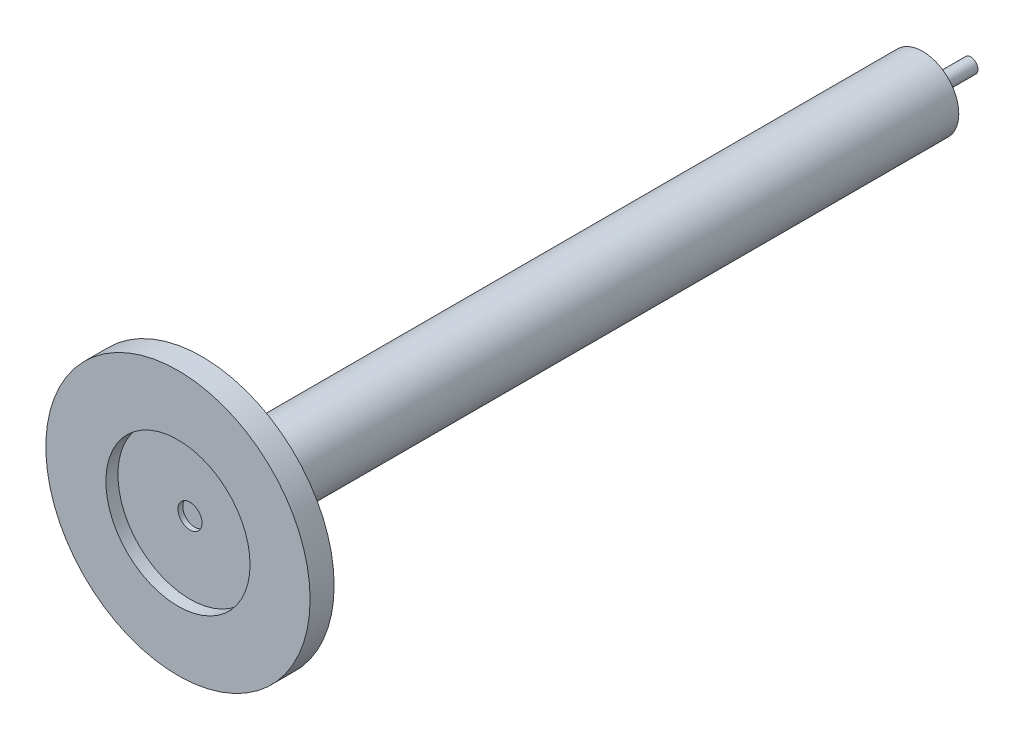
ISO-10303-21;
HEADER;
FILE_DESCRIPTION(('STEP AP214'),'2;1');
FILE_NAME('part.step','',(''),(''),'','','');
FILE_SCHEMA(('AUTOMOTIVE_DESIGN { 1 0 10303 214 1 1 1 1 }'));
ENDSEC;
DATA;
#1=APPLICATION_CONTEXT('core data for automotive mechanical design processes');
#2=APPLICATION_PROTOCOL_DEFINITION('international standard','automotive_design',2000,#1);
#3=PRODUCT_CONTEXT('',#1,'mechanical');
#4=PRODUCT('Part','Part','',(#3));
#5=PRODUCT_RELATED_PRODUCT_CATEGORY('part','',(#4));
#6=PRODUCT_DEFINITION_FORMATION('','',#4);
#7=PRODUCT_DEFINITION_CONTEXT('part definition',#1,'design');
#8=PRODUCT_DEFINITION('design','',#6,#7);
#9=PRODUCT_DEFINITION_SHAPE('','',#8);
#10=(LENGTH_UNIT() NAMED_UNIT(*) SI_UNIT(.MILLI.,.METRE.));
#11=(NAMED_UNIT(*) PLANE_ANGLE_UNIT() SI_UNIT($,.RADIAN.));
#12=(NAMED_UNIT(*) SI_UNIT($,.STERADIAN.) SOLID_ANGLE_UNIT());
#13=UNCERTAINTY_MEASURE_WITH_UNIT(LENGTH_MEASURE(1.E-05),#10,'distance_accuracy_value','');
#14=(GEOMETRIC_REPRESENTATION_CONTEXT(3) GLOBAL_UNCERTAINTY_ASSIGNED_CONTEXT((#13)) GLOBAL_UNIT_ASSIGNED_CONTEXT((#10,
#11,#12)) REPRESENTATION_CONTEXT('',''));
#15=CARTESIAN_POINT('',(0.,0.,0.));
#16=DIRECTION('',(0.,0.,1.));
#17=DIRECTION('',(1.,0.,0.));
#18=AXIS2_PLACEMENT_3D('',#15,#16,#17);
#19=CARTESIAN_POINT('',(0.,0.,-762.));
#20=DIRECTION('',(0.,0.,-1.));
#21=DIRECTION('',(-1.,0.,0.));
#22=AXIS2_PLACEMENT_3D('',#19,#20,#21);
#23=PLANE('',#22);
#24=CARTESIAN_POINT('',(0.,0.,-762.));
#25=DIRECTION('',(0.,0.,-1.));
#26=DIRECTION('',(-1.,0.,0.));
#27=AXIS2_PLACEMENT_3D('',#24,#25,#26);
#28=CIRCLE('',#27,38.1);
#29=CARTESIAN_POINT('',(-38.1,0.,-762.));
#30=VERTEX_POINT('',#29);
#31=EDGE_CURVE('E47',#30,#30,#28,.T.);
#32=ORIENTED_EDGE('',*,*,#31,.T.);
#33=EDGE_LOOP('',(#32));
#34=FACE_BOUND('',#33,.T.);
#35=CARTESIAN_POINT('',(0.,0.,-762.));
#36=DIRECTION('',(0.,0.,-1.));
#37=DIRECTION('',(-1.,0.,0.));
#38=AXIS2_PLACEMENT_3D('',#35,#36,#37);
#39=CIRCLE('',#38,7.62);
#40=CARTESIAN_POINT('',(-7.62,0.,-762.));
#41=VERTEX_POINT('',#40);
#42=EDGE_CURVE('E52',#41,#41,#39,.T.);
#43=ORIENTED_EDGE('',*,*,#42,.F.);
#44=EDGE_LOOP('',(#43));
#45=FACE_BOUND('',#44,.T.);
#46=ADVANCED_FACE('F31',(#34,#45),#23,.T.);
#47=CARTESIAN_POINT('',(0.,0.,0.));
#48=DIRECTION('',(0.,0.,1.));
#49=DIRECTION('',(1.,0.,0.));
#50=AXIS2_PLACEMENT_3D('',#47,#48,#49);
#51=PLANE('',#50);
#52=CARTESIAN_POINT('',(0.,0.,0.));
#53=DIRECTION('',(0.,0.,1.));
#54=DIRECTION('',(1.,0.,0.));
#55=AXIS2_PLACEMENT_3D('',#52,#53,#54);
#56=CIRCLE('',#55,139.7);
#57=CARTESIAN_POINT('',(139.7,0.,0.));
#58=VERTEX_POINT('',#57);
#59=EDGE_CURVE('E42',#58,#58,#56,.T.);
#60=ORIENTED_EDGE('',*,*,#59,.F.);
#61=EDGE_LOOP('',(#60));
#62=FACE_BOUND('',#61,.T.);
#63=CARTESIAN_POINT('',(0.,0.,0.));
#64=DIRECTION('',(0.,0.,1.));
#65=DIRECTION('',(1.,0.,0.));
#66=AXIS2_PLACEMENT_3D('',#63,#64,#65);
#67=CIRCLE('',#66,38.1);
#68=CARTESIAN_POINT('',(38.1,0.,0.));
#69=VERTEX_POINT('',#68);
#70=EDGE_CURVE('E10',#69,#69,#67,.F.);
#71=ORIENTED_EDGE('',*,*,#70,.F.);
#72=EDGE_LOOP('',(#71));
#73=FACE_BOUND('',#72,.T.);
#74=ADVANCED_FACE('F102',(#62,#73),#51,.F.);
#75=CARTESIAN_POINT('',(0.,0.,25.4));
#76=DIRECTION('',(0.,0.,-1.));
#77=DIRECTION('',(-1.,0.,0.));
#78=AXIS2_PLACEMENT_3D('',#75,#76,#77);
#79=CYLINDRICAL_SURFACE('',#78,139.7);
#80=CARTESIAN_POINT('',(0.,0.,25.4));
#81=DIRECTION('',(0.,0.,1.));
#82=DIRECTION('',(1.,0.,0.));
#83=AXIS2_PLACEMENT_3D('',#80,#81,#82);
#84=CIRCLE('',#83,139.7);
#85=CARTESIAN_POINT('',(139.7,0.,25.4));
#86=VERTEX_POINT('',#85);
#87=EDGE_CURVE('E38',#86,#86,#84,.T.);
#88=ORIENTED_EDGE('',*,*,#87,.F.);
#89=EDGE_LOOP('',(#88));
#90=FACE_BOUND('',#89,.T.);
#91=ORIENTED_EDGE('',*,*,#59,.T.);
#92=EDGE_LOOP('',(#91));
#93=FACE_BOUND('',#92,.T.);
#94=ADVANCED_FACE('F33',(#90,#93),#79,.T.);
#95=CARTESIAN_POINT('',(0.,0.,25.4));
#96=DIRECTION('',(0.,0.,1.));
#97=DIRECTION('',(1.,0.,0.));
#98=AXIS2_PLACEMENT_3D('',#95,#96,#97);
#99=PLANE('',#98);
#100=CARTESIAN_POINT('',(0.,0.,25.4));
#101=DIRECTION('',(0.,0.,1.));
#102=DIRECTION('',(1.,0.,0.));
#103=AXIS2_PLACEMENT_3D('',#100,#101,#102);
#104=CIRCLE('',#103,76.2);
#105=CARTESIAN_POINT('',(76.2,0.,25.4));
#106=VERTEX_POINT('',#105);
#107=EDGE_CURVE('E58',#106,#106,#104,.T.);
#108=ORIENTED_EDGE('',*,*,#107,.F.);
#109=EDGE_LOOP('',(#108));
#110=FACE_BOUND('',#109,.T.);
#111=ORIENTED_EDGE('',*,*,#87,.T.);
#112=EDGE_LOOP('',(#111));
#113=FACE_BOUND('',#112,.T.);
#114=ADVANCED_FACE('F91',(#110,#113),#99,.T.);
#115=CARTESIAN_POINT('',(0.,0.,-762.));
#116=DIRECTION('',(0.,0.,1.));
#117=DIRECTION('',(1.,0.,0.));
#118=AXIS2_PLACEMENT_3D('',#115,#116,#117);
#119=CYLINDRICAL_SURFACE('',#118,38.1);
#120=ORIENTED_EDGE('',*,*,#31,.F.);
#121=EDGE_LOOP('',(#120));
#122=FACE_BOUND('',#121,.T.);
#123=ORIENTED_EDGE('',*,*,#70,.T.);
#124=EDGE_LOOP('',(#123));
#125=FACE_BOUND('',#124,.T.);
#126=ADVANCED_FACE('F93',(#122,#125),#119,.T.);
#127=CARTESIAN_POINT('',(0.,0.,-812.8));
#128=DIRECTION('',(0.,0.,1.));
#129=DIRECTION('',(1.,0.,0.));
#130=AXIS2_PLACEMENT_3D('',#127,#128,#129);
#131=CYLINDRICAL_SURFACE('',#130,7.62);
#132=CARTESIAN_POINT('',(0.,0.,-812.8));
#133=DIRECTION('',(0.,0.,-1.));
#134=DIRECTION('',(-1.,0.,0.));
#135=AXIS2_PLACEMENT_3D('',#132,#133,#134);
#136=CIRCLE('',#135,7.62);
#137=CARTESIAN_POINT('',(-7.62,0.,-812.8));
#138=VERTEX_POINT('',#137);
#139=EDGE_CURVE('E51',#138,#138,#136,.T.);
#140=ORIENTED_EDGE('',*,*,#139,.F.);
#141=EDGE_LOOP('',(#140));
#142=FACE_BOUND('',#141,.T.);
#143=ORIENTED_EDGE('',*,*,#42,.T.);
#144=EDGE_LOOP('',(#143));
#145=FACE_BOUND('',#144,.T.);
#146=ADVANCED_FACE('F99',(#142,#145),#131,.T.);
#147=CARTESIAN_POINT('',(0.,0.,-812.8));
#148=DIRECTION('',(0.,0.,-1.));
#149=DIRECTION('',(-1.,0.,0.));
#150=AXIS2_PLACEMENT_3D('',#147,#148,#149);
#151=PLANE('',#150);
#152=ORIENTED_EDGE('',*,*,#139,.T.);
#153=EDGE_LOOP('',(#152));
#154=FACE_BOUND('',#153,.T.);
#155=ADVANCED_FACE('F87',(#154),#151,.T.);
#156=CARTESIAN_POINT('',(0.,0.,12.7));
#157=DIRECTION('',(0.,0.,1.));
#158=DIRECTION('',(1.,0.,0.));
#159=AXIS2_PLACEMENT_3D('',#156,#157,#158);
#160=CYLINDRICAL_SURFACE('',#159,76.2);
#161=CARTESIAN_POINT('',(0.,0.,12.7));
#162=DIRECTION('',(0.,0.,1.));
#163=DIRECTION('',(1.,0.,0.));
#164=AXIS2_PLACEMENT_3D('',#161,#162,#163);
#165=CIRCLE('',#164,76.2);
#166=CARTESIAN_POINT('',(76.2,0.,12.7));
#167=VERTEX_POINT('',#166);
#168=EDGE_CURVE('E55',#167,#167,#165,.T.);
#169=ORIENTED_EDGE('',*,*,#168,.F.);
#170=EDGE_LOOP('',(#169));
#171=FACE_BOUND('',#170,.T.);
#172=ORIENTED_EDGE('',*,*,#107,.T.);
#173=EDGE_LOOP('',(#172));
#174=FACE_BOUND('',#173,.T.);
#175=ADVANCED_FACE('F81',(#171,#174),#160,.F.);
#176=CARTESIAN_POINT('',(0.,0.,12.7));
#177=DIRECTION('',(0.,0.,1.));
#178=DIRECTION('',(1.,0.,0.));
#179=AXIS2_PLACEMENT_3D('',#176,#177,#178);
#180=PLANE('',#179);
#181=CARTESIAN_POINT('',(0.,0.,12.7));
#182=DIRECTION('',(0.,0.,1.));
#183=DIRECTION('',(1.,0.,0.));
#184=AXIS2_PLACEMENT_3D('',#181,#182,#183);
#185=CIRCLE('',#184,12.7);
#186=CARTESIAN_POINT('',(12.7,0.,12.7));
#187=VERTEX_POINT('',#186);
#188=EDGE_CURVE('E64',#187,#187,#185,.T.);
#189=ORIENTED_EDGE('',*,*,#188,.F.);
#190=EDGE_LOOP('',(#189));
#191=FACE_BOUND('',#190,.T.);
#192=ORIENTED_EDGE('',*,*,#168,.T.);
#193=EDGE_LOOP('',(#192));
#194=FACE_BOUND('',#193,.T.);
#195=ADVANCED_FACE('F75',(#191,#194),#180,.T.);
#196=CARTESIAN_POINT('',(0.,0.,7.62));
#197=DIRECTION('',(0.,0.,1.));
#198=DIRECTION('',(1.,0.,0.));
#199=AXIS2_PLACEMENT_3D('',#196,#197,#198);
#200=CYLINDRICAL_SURFACE('',#199,12.7);
#201=CARTESIAN_POINT('',(0.,0.,7.62));
#202=DIRECTION('',(0.,0.,1.));
#203=DIRECTION('',(1.,0.,0.));
#204=AXIS2_PLACEMENT_3D('',#201,#202,#203);
#205=CIRCLE('',#204,12.7);
#206=CARTESIAN_POINT('',(12.7,0.,7.62));
#207=VERTEX_POINT('',#206);
#208=EDGE_CURVE('E61',#207,#207,#205,.T.);
#209=ORIENTED_EDGE('',*,*,#208,.F.);
#210=EDGE_LOOP('',(#209));
#211=FACE_BOUND('',#210,.T.);
#212=ORIENTED_EDGE('',*,*,#188,.T.);
#213=EDGE_LOOP('',(#212));
#214=FACE_BOUND('',#213,.T.);
#215=ADVANCED_FACE('F72',(#211,#214),#200,.F.);
#216=CARTESIAN_POINT('',(0.,0.,7.62));
#217=DIRECTION('',(0.,0.,1.));
#218=DIRECTION('',(1.,0.,0.));
#219=AXIS2_PLACEMENT_3D('',#216,#217,#218);
#220=PLANE('',#219);
#221=ORIENTED_EDGE('',*,*,#208,.T.);
#222=EDGE_LOOP('',(#221));
#223=FACE_BOUND('',#222,.T.);
#224=ADVANCED_FACE('F70',(#223),#220,.T.);
#225=CLOSED_SHELL('',(#46,#74,#94,#114,#126,#146,#155,#175,#195,#215,#224));
#226=MANIFOLD_SOLID_BREP('B2',#225);
#227=ADVANCED_BREP_SHAPE_REPRESENTATION('',(#18,#226),#14);
#228=SHAPE_DEFINITION_REPRESENTATION(#9,#227);
ENDSEC;
END-ISO-10303-21;
